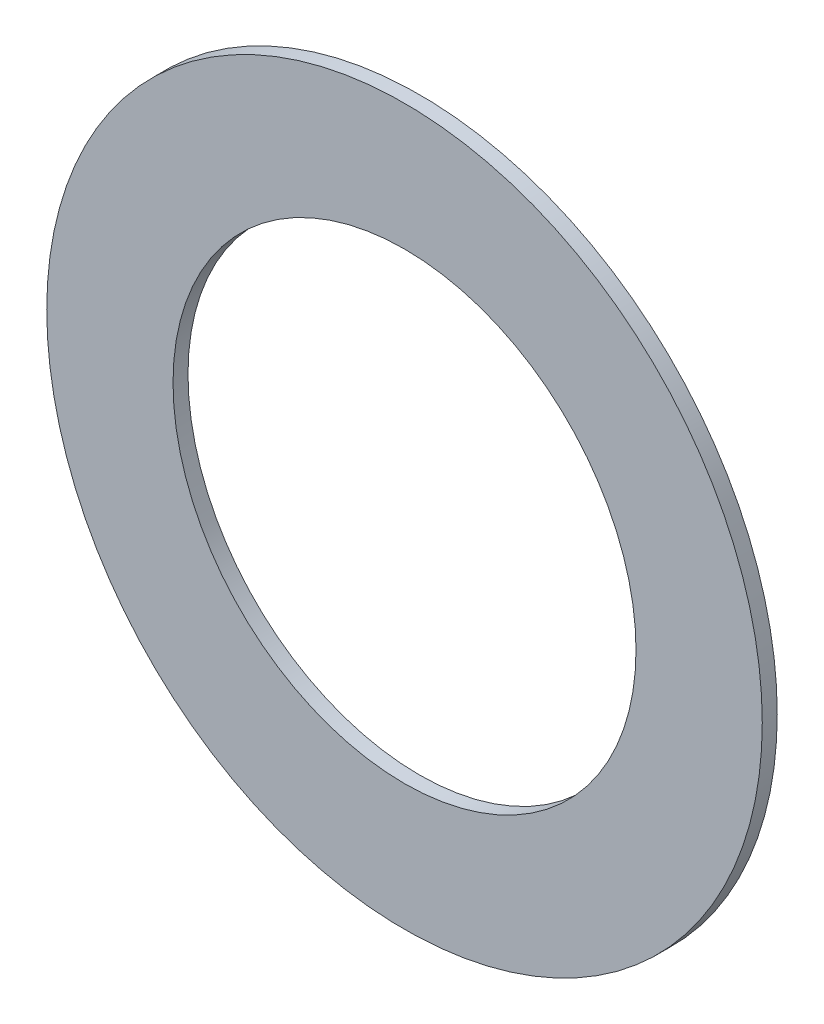
ISO-10303-21;
HEADER;
FILE_DESCRIPTION(('STEP AP214'),'2;1');
FILE_NAME('part.step','',(''),(''),'','','');
FILE_SCHEMA(('AUTOMOTIVE_DESIGN { 1 0 10303 214 1 1 1 1 }'));
ENDSEC;
DATA;
#1=APPLICATION_CONTEXT('core data for automotive mechanical design processes');
#2=APPLICATION_PROTOCOL_DEFINITION('international standard','automotive_design',2000,#1);
#3=PRODUCT_CONTEXT('',#1,'mechanical');
#4=PRODUCT('Part','Part','',(#3));
#5=PRODUCT_RELATED_PRODUCT_CATEGORY('part','',(#4));
#6=PRODUCT_DEFINITION_FORMATION('','',#4);
#7=PRODUCT_DEFINITION_CONTEXT('part definition',#1,'design');
#8=PRODUCT_DEFINITION('design','',#6,#7);
#9=PRODUCT_DEFINITION_SHAPE('','',#8);
#10=(LENGTH_UNIT() NAMED_UNIT(*) SI_UNIT(.MILLI.,.METRE.));
#11=(NAMED_UNIT(*) PLANE_ANGLE_UNIT() SI_UNIT($,.RADIAN.));
#12=(NAMED_UNIT(*) SI_UNIT($,.STERADIAN.) SOLID_ANGLE_UNIT());
#13=UNCERTAINTY_MEASURE_WITH_UNIT(LENGTH_MEASURE(1.E-05),#10,'distance_accuracy_value','');
#14=(GEOMETRIC_REPRESENTATION_CONTEXT(3) GLOBAL_UNCERTAINTY_ASSIGNED_CONTEXT((#13)) GLOBAL_UNIT_ASSIGNED_CONTEXT((#10,
#11,#12)) REPRESENTATION_CONTEXT('',''));
#15=CARTESIAN_POINT('',(0.,0.,0.));
#16=DIRECTION('',(0.,0.,1.));
#17=DIRECTION('',(1.,0.,0.));
#18=AXIS2_PLACEMENT_3D('',#15,#16,#17);
#19=CARTESIAN_POINT('',(0.,0.,0.));
#20=DIRECTION('',(0.,0.,-1.));
#21=DIRECTION('',(1.,0.,0.));
#22=AXIS2_PLACEMENT_3D('',#19,#20,#21);
#23=CYLINDRICAL_SURFACE('',#22,0.8499983);
#24=CARTESIAN_POINT('',(0.,0.,0.03556));
#25=DIRECTION('',(0.,0.,1.));
#26=DIRECTION('',(1.,0.,0.));
#27=AXIS2_PLACEMENT_3D('',#24,#25,#26);
#28=CIRCLE('',#27,0.8499983);
#29=CARTESIAN_POINT('',(0.8499983,0.,0.03556));
#30=VERTEX_POINT('',#29);
#31=EDGE_CURVE('E11',#30,#30,#28,.T.);
#32=ORIENTED_EDGE('',*,*,#31,.F.);
#33=DIRECTION('',(0.,0.,1.));
#34=VECTOR('',#33,1.);
#35=CARTESIAN_POINT('',(0.8499983,0.,0.));
#36=LINE('',#35,#34);
#37=CARTESIAN_POINT('',(0.8499983,0.,0.));
#38=VERTEX_POINT('',#37);
#39=EDGE_CURVE('E24',#38,#30,#36,.T.);
#40=ORIENTED_EDGE('',*,*,#39,.F.);
#41=CARTESIAN_POINT('',(0.,0.,0.));
#42=DIRECTION('',(0.,0.,1.));
#43=DIRECTION('',(1.,0.,0.));
#44=AXIS2_PLACEMENT_3D('',#41,#42,#43);
#45=CIRCLE('',#44,0.8499983);
#46=EDGE_CURVE('E46',#38,#38,#45,.T.);
#47=ORIENTED_EDGE('',*,*,#46,.T.);
#48=ORIENTED_EDGE('',*,*,#39,.T.);
#49=EDGE_LOOP('',(#32,#40,#47,#48));
#50=FACE_BOUND('',#49,.T.);
#51=ADVANCED_FACE('F17',(#50),#23,.T.);
#52=CARTESIAN_POINT('',(0.,0.,0.));
#53=DIRECTION('',(0.,0.,-1.));
#54=DIRECTION('',(1.,0.,0.));
#55=AXIS2_PLACEMENT_3D('',#52,#53,#54);
#56=CYLINDRICAL_SURFACE('',#55,0.5499989);
#57=DIRECTION('',(0.,0.,1.));
#58=VECTOR('',#57,1.);
#59=CARTESIAN_POINT('',(0.5499989,0.,0.));
#60=LINE('',#59,#58);
#61=CARTESIAN_POINT('',(0.5499989,0.,0.));
#62=VERTEX_POINT('',#61);
#63=CARTESIAN_POINT('',(0.5499989,0.,0.03556));
#64=VERTEX_POINT('',#63);
#65=EDGE_CURVE('E40',#62,#64,#60,.T.);
#66=ORIENTED_EDGE('',*,*,#65,.T.);
#67=CARTESIAN_POINT('',(0.,0.,0.03556));
#68=DIRECTION('',(0.,0.,1.));
#69=DIRECTION('',(1.,0.,0.));
#70=AXIS2_PLACEMENT_3D('',#67,#68,#69);
#71=CIRCLE('',#70,0.5499989);
#72=EDGE_CURVE('E45',#64,#64,#71,.T.);
#73=ORIENTED_EDGE('',*,*,#72,.T.);
#74=ORIENTED_EDGE('',*,*,#65,.F.);
#75=CARTESIAN_POINT('',(0.,0.,0.));
#76=DIRECTION('',(0.,0.,1.));
#77=DIRECTION('',(1.,0.,0.));
#78=AXIS2_PLACEMENT_3D('',#75,#76,#77);
#79=CIRCLE('',#78,0.5499989);
#80=EDGE_CURVE('E43',#62,#62,#79,.T.);
#81=ORIENTED_EDGE('',*,*,#80,.F.);
#82=EDGE_LOOP('',(#66,#73,#74,#81));
#83=FACE_BOUND('',#82,.T.);
#84=ADVANCED_FACE('F42',(#83),#56,.F.);
#85=CARTESIAN_POINT('',(0.8499983,0.,0.));
#86=DIRECTION('',(0.,0.,-1.));
#87=DIRECTION('',(-1.,0.,0.));
#88=AXIS2_PLACEMENT_3D('',#85,#86,#87);
#89=PLANE('',#88);
#90=ORIENTED_EDGE('',*,*,#46,.F.);
#91=EDGE_LOOP('',(#90));
#92=FACE_BOUND('',#91,.T.);
#93=ORIENTED_EDGE('',*,*,#80,.T.);
#94=EDGE_LOOP('',(#93));
#95=FACE_BOUND('',#94,.T.);
#96=ADVANCED_FACE('F49',(#92,#95),#89,.T.);
#97=CARTESIAN_POINT('',(0.8499983,0.,0.03556));
#98=DIRECTION('',(0.,0.,-1.));
#99=DIRECTION('',(-1.,0.,0.));
#100=AXIS2_PLACEMENT_3D('',#97,#98,#99);
#101=PLANE('',#100);
#102=ORIENTED_EDGE('',*,*,#31,.T.);
#103=EDGE_LOOP('',(#102));
#104=FACE_BOUND('',#103,.T.);
#105=ORIENTED_EDGE('',*,*,#72,.F.);
#106=EDGE_LOOP('',(#105));
#107=FACE_BOUND('',#106,.T.);
#108=ADVANCED_FACE('F56',(#104,#107),#101,.F.);
#109=CLOSED_SHELL('',(#51,#84,#96,#108));
#110=MANIFOLD_SOLID_BREP('B1',#109);
#111=ADVANCED_BREP_SHAPE_REPRESENTATION('',(#18,#110),#14);
#112=SHAPE_DEFINITION_REPRESENTATION(#9,#111);
ENDSEC;
END-ISO-10303-21;
